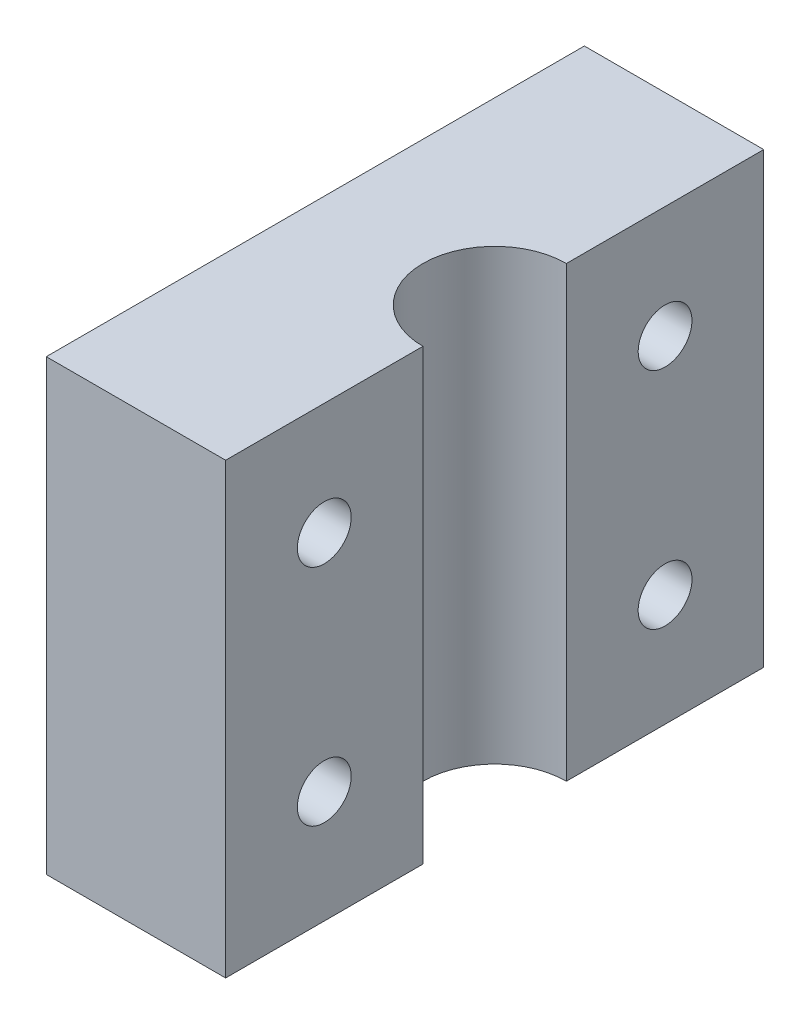
ISO-10303-21;
HEADER;
FILE_DESCRIPTION(('STEP AP214'),'2;1');
FILE_NAME('part.step','',(''),(''),'','','');
FILE_SCHEMA(('AUTOMOTIVE_DESIGN { 1 0 10303 214 1 1 1 1 }'));
ENDSEC;
DATA;
#1=APPLICATION_CONTEXT('core data for automotive mechanical design processes');
#2=APPLICATION_PROTOCOL_DEFINITION('international standard','automotive_design',2000,#1);
#3=PRODUCT_CONTEXT('',#1,'mechanical');
#4=PRODUCT('Part','Part','',(#3));
#5=PRODUCT_RELATED_PRODUCT_CATEGORY('part','',(#4));
#6=PRODUCT_DEFINITION_FORMATION('','',#4);
#7=PRODUCT_DEFINITION_CONTEXT('part definition',#1,'design');
#8=PRODUCT_DEFINITION('design','',#6,#7);
#9=PRODUCT_DEFINITION_SHAPE('','',#8);
#10=(LENGTH_UNIT() NAMED_UNIT(*) SI_UNIT(.MILLI.,.METRE.));
#11=(NAMED_UNIT(*) PLANE_ANGLE_UNIT() SI_UNIT($,.RADIAN.));
#12=(NAMED_UNIT(*) SI_UNIT($,.STERADIAN.) SOLID_ANGLE_UNIT());
#13=UNCERTAINTY_MEASURE_WITH_UNIT(LENGTH_MEASURE(1.E-05),#10,'distance_accuracy_value','');
#14=(GEOMETRIC_REPRESENTATION_CONTEXT(3) GLOBAL_UNCERTAINTY_ASSIGNED_CONTEXT((#13)) GLOBAL_UNIT_ASSIGNED_CONTEXT((#10,
#11,#12)) REPRESENTATION_CONTEXT('',''));
#15=CARTESIAN_POINT('',(0.,0.,0.));
#16=DIRECTION('',(0.,0.,1.));
#17=DIRECTION('',(1.,0.,0.));
#18=AXIS2_PLACEMENT_3D('',#15,#16,#17);
#19=CARTESIAN_POINT('',(10.,0.,0.));
#20=DIRECTION('',(-1.,0.,0.));
#21=DIRECTION('',(0.,0.,1.));
#22=AXIS2_PLACEMENT_3D('',#19,#20,#21);
#23=PLANE('',#22);
#24=CARTESIAN_POINT('',(10.,6.25,-5.5));
#25=DIRECTION('',(-1.,0.,0.));
#26=DIRECTION('',(0.,0.,1.));
#27=AXIS2_PLACEMENT_3D('',#24,#25,#26);
#28=CIRCLE('',#27,1.5);
#29=CARTESIAN_POINT('',(10.,6.25,-4.));
#30=VERTEX_POINT('',#29);
#31=EDGE_CURVE('E138',#30,#30,#28,.T.);
#32=ORIENTED_EDGE('',*,*,#31,.T.);
#33=EDGE_LOOP('',(#32));
#34=FACE_BOUND('',#33,.T.);
#35=CARTESIAN_POINT('',(10.,18.75,-5.5));
#36=DIRECTION('',(1.,0.,0.));
#37=DIRECTION('',(0.,0.,-1.));
#38=AXIS2_PLACEMENT_3D('',#35,#36,#37);
#39=CIRCLE('',#38,1.5);
#40=CARTESIAN_POINT('',(10.,18.75,-7.));
#41=VERTEX_POINT('',#40);
#42=EDGE_CURVE('E135',#41,#41,#39,.T.);
#43=ORIENTED_EDGE('',*,*,#42,.F.);
#44=EDGE_LOOP('',(#43));
#45=FACE_BOUND('',#44,.T.);
#46=DIRECTION('',(0.,0.,-1.));
#47=VECTOR('',#46,1.);
#48=CARTESIAN_POINT('',(10.,0.,0.));
#49=LINE('',#48,#47);
#50=CARTESIAN_POINT('',(10.,0.,0.));
#51=VERTEX_POINT('',#50);
#52=CARTESIAN_POINT('',(10.,0.,-11.));
#53=VERTEX_POINT('',#52);
#54=EDGE_CURVE('E85',#51,#53,#49,.T.);
#55=ORIENTED_EDGE('',*,*,#54,.T.);
#56=DIRECTION('',(0.,1.,0.));
#57=VECTOR('',#56,1.);
#58=CARTESIAN_POINT('',(10.,0.,-11.));
#59=LINE('',#58,#57);
#60=CARTESIAN_POINT('',(10.,25.,-11.));
#61=VERTEX_POINT('',#60);
#62=EDGE_CURVE('E11',#53,#61,#59,.T.);
#63=ORIENTED_EDGE('',*,*,#62,.T.);
#64=DIRECTION('',(0.,0.,1.));
#65=VECTOR('',#64,1.);
#66=CARTESIAN_POINT('',(10.,25.,0.));
#67=LINE('',#66,#65);
#68=CARTESIAN_POINT('',(10.,25.,0.));
#69=VERTEX_POINT('',#68);
#70=EDGE_CURVE('E56',#61,#69,#67,.T.);
#71=ORIENTED_EDGE('',*,*,#70,.T.);
#72=DIRECTION('',(0.,-1.,0.));
#73=VECTOR('',#72,1.);
#74=CARTESIAN_POINT('',(10.,0.,0.));
#75=LINE('',#74,#73);
#76=EDGE_CURVE('E117',#69,#51,#75,.T.);
#77=ORIENTED_EDGE('',*,*,#76,.T.);
#78=EDGE_LOOP('',(#55,#63,#71,#77));
#79=FACE_BOUND('',#78,.T.);
#80=ADVANCED_FACE('F33',(#34,#45,#79),#23,.F.);
#81=CARTESIAN_POINT('',(10.,0.,0.));
#82=DIRECTION('',(0.,0.,-1.));
#83=DIRECTION('',(-1.,0.,0.));
#84=AXIS2_PLACEMENT_3D('',#81,#82,#83);
#85=PLANE('',#84);
#86=DIRECTION('',(0.,-1.,0.));
#87=VECTOR('',#86,1.);
#88=CARTESIAN_POINT('',(0.,0.,0.));
#89=LINE('',#88,#87);
#90=CARTESIAN_POINT('',(0.,25.,0.));
#91=VERTEX_POINT('',#90);
#92=CARTESIAN_POINT('',(0.,0.,0.));
#93=VERTEX_POINT('',#92);
#94=EDGE_CURVE('E109',#91,#93,#89,.T.);
#95=ORIENTED_EDGE('',*,*,#94,.T.);
#96=DIRECTION('',(-1.,0.,0.));
#97=VECTOR('',#96,1.);
#98=CARTESIAN_POINT('',(10.,0.,0.));
#99=LINE('',#98,#97);
#100=EDGE_CURVE('E124',#51,#93,#99,.T.);
#101=ORIENTED_EDGE('',*,*,#100,.F.);
#102=ORIENTED_EDGE('',*,*,#76,.F.);
#103=DIRECTION('',(-1.,0.,0.));
#104=VECTOR('',#103,1.);
#105=CARTESIAN_POINT('',(10.,25.,0.));
#106=LINE('',#105,#104);
#107=EDGE_CURVE('E101',#69,#91,#106,.T.);
#108=ORIENTED_EDGE('',*,*,#107,.T.);
#109=EDGE_LOOP('',(#95,#101,#102,#108));
#110=FACE_BOUND('',#109,.T.);
#111=ADVANCED_FACE('F35',(#110),#85,.F.);
#112=CARTESIAN_POINT('',(10.,0.,0.));
#113=DIRECTION('',(0.,1.,0.));
#114=DIRECTION('',(0.,0.,1.));
#115=AXIS2_PLACEMENT_3D('',#112,#113,#114);
#116=PLANE('',#115);
#117=CARTESIAN_POINT('',(10.,0.,-19.));
#118=VERTEX_POINT('',#117);
#119=CARTESIAN_POINT('',(10.,0.,-30.));
#120=VERTEX_POINT('',#119);
#121=EDGE_CURVE('E128',#118,#120,#49,.T.);
#122=ORIENTED_EDGE('',*,*,#121,.F.);
#123=CARTESIAN_POINT('',(10.,0.,-15.));
#124=DIRECTION('',(0.,1.,0.));
#125=DIRECTION('',(0.,0.,1.));
#126=AXIS2_PLACEMENT_3D('',#123,#124,#125);
#127=CIRCLE('',#126,4.);
#128=EDGE_CURVE('E48',#118,#53,#127,.T.);
#129=ORIENTED_EDGE('',*,*,#128,.T.);
#130=ORIENTED_EDGE('',*,*,#54,.F.);
#131=ORIENTED_EDGE('',*,*,#100,.T.);
#132=DIRECTION('',(0.,0.,-1.));
#133=VECTOR('',#132,1.);
#134=CARTESIAN_POINT('',(0.,0.,0.));
#135=LINE('',#134,#133);
#136=CARTESIAN_POINT('',(0.,0.,-30.));
#137=VERTEX_POINT('',#136);
#138=EDGE_CURVE('E112',#93,#137,#135,.T.);
#139=ORIENTED_EDGE('',*,*,#138,.T.);
#140=DIRECTION('',(-1.,0.,0.));
#141=VECTOR('',#140,1.);
#142=CARTESIAN_POINT('',(10.,0.,-30.));
#143=LINE('',#142,#141);
#144=EDGE_CURVE('E121',#120,#137,#143,.T.);
#145=ORIENTED_EDGE('',*,*,#144,.F.);
#146=EDGE_LOOP('',(#122,#129,#130,#131,#139,#145));
#147=FACE_BOUND('',#146,.T.);
#148=ADVANCED_FACE('F130',(#147),#116,.F.);
#149=CARTESIAN_POINT('',(10.,0.,-30.));
#150=DIRECTION('',(0.,0.,1.));
#151=DIRECTION('',(1.,0.,0.));
#152=AXIS2_PLACEMENT_3D('',#149,#150,#151);
#153=PLANE('',#152);
#154=DIRECTION('',(0.,1.,0.));
#155=VECTOR('',#154,1.);
#156=CARTESIAN_POINT('',(0.,0.,-30.));
#157=LINE('',#156,#155);
#158=CARTESIAN_POINT('',(0.,25.,-30.));
#159=VERTEX_POINT('',#158);
#160=EDGE_CURVE('E114',#137,#159,#157,.T.);
#161=ORIENTED_EDGE('',*,*,#160,.T.);
#162=DIRECTION('',(-1.,0.,0.));
#163=VECTOR('',#162,1.);
#164=CARTESIAN_POINT('',(10.,25.,-30.));
#165=LINE('',#164,#163);
#166=CARTESIAN_POINT('',(10.,25.,-30.));
#167=VERTEX_POINT('',#166);
#168=EDGE_CURVE('E119',#167,#159,#165,.T.);
#169=ORIENTED_EDGE('',*,*,#168,.F.);
#170=DIRECTION('',(0.,1.,0.));
#171=VECTOR('',#170,1.);
#172=CARTESIAN_POINT('',(10.,0.,-30.));
#173=LINE('',#172,#171);
#174=EDGE_CURVE('E104',#120,#167,#173,.T.);
#175=ORIENTED_EDGE('',*,*,#174,.F.);
#176=ORIENTED_EDGE('',*,*,#144,.T.);
#177=EDGE_LOOP('',(#161,#169,#175,#176));
#178=FACE_BOUND('',#177,.T.);
#179=ADVANCED_FACE('F189',(#178),#153,.F.);
#180=CARTESIAN_POINT('',(10.,25.,0.));
#181=DIRECTION('',(0.,-1.,0.));
#182=DIRECTION('',(0.,0.,-1.));
#183=AXIS2_PLACEMENT_3D('',#180,#181,#182);
#184=PLANE('',#183);
#185=ORIENTED_EDGE('',*,*,#70,.F.);
#186=CARTESIAN_POINT('',(10.,25.,-15.));
#187=DIRECTION('',(0.,1.,0.));
#188=DIRECTION('',(0.,0.,1.));
#189=AXIS2_PLACEMENT_3D('',#186,#187,#188);
#190=CIRCLE('',#189,4.);
#191=CARTESIAN_POINT('',(10.,25.,-19.));
#192=VERTEX_POINT('',#191);
#193=EDGE_CURVE('E94',#192,#61,#190,.T.);
#194=ORIENTED_EDGE('',*,*,#193,.F.);
#195=EDGE_CURVE('E103',#167,#192,#67,.T.);
#196=ORIENTED_EDGE('',*,*,#195,.F.);
#197=ORIENTED_EDGE('',*,*,#168,.T.);
#198=DIRECTION('',(0.,0.,1.));
#199=VECTOR('',#198,1.);
#200=CARTESIAN_POINT('',(0.,25.,0.));
#201=LINE('',#200,#199);
#202=EDGE_CURVE('E78',#159,#91,#201,.T.);
#203=ORIENTED_EDGE('',*,*,#202,.T.);
#204=ORIENTED_EDGE('',*,*,#107,.F.);
#205=EDGE_LOOP('',(#185,#194,#196,#197,#203,#204));
#206=FACE_BOUND('',#205,.T.);
#207=ADVANCED_FACE('F100',(#206),#184,.F.);
#208=CARTESIAN_POINT('',(10.,18.75,-24.5));
#209=DIRECTION('',(-1.,0.,0.));
#210=DIRECTION('',(0.,0.,1.));
#211=AXIS2_PLACEMENT_3D('',#208,#209,#210);
#212=CIRCLE('',#211,1.5);
#213=CARTESIAN_POINT('',(10.,18.75,-23.));
#214=VERTEX_POINT('',#213);
#215=EDGE_CURVE('E150',#214,#214,#212,.T.);
#216=ORIENTED_EDGE('',*,*,#215,.T.);
#217=EDGE_LOOP('',(#216));
#218=FACE_BOUND('',#217,.T.);
#219=CARTESIAN_POINT('',(10.,6.25,-24.5));
#220=DIRECTION('',(1.,0.,0.));
#221=DIRECTION('',(0.,0.,-1.));
#222=AXIS2_PLACEMENT_3D('',#219,#220,#221);
#223=CIRCLE('',#222,1.5);
#224=CARTESIAN_POINT('',(10.,6.25,-26.));
#225=VERTEX_POINT('',#224);
#226=EDGE_CURVE('E144',#225,#225,#223,.T.);
#227=ORIENTED_EDGE('',*,*,#226,.F.);
#228=EDGE_LOOP('',(#227));
#229=FACE_BOUND('',#228,.T.);
#230=ORIENTED_EDGE('',*,*,#195,.T.);
#231=DIRECTION('',(0.,1.,0.));
#232=VECTOR('',#231,1.);
#233=CARTESIAN_POINT('',(10.,0.,-19.));
#234=LINE('',#233,#232);
#235=EDGE_CURVE('E41',#192,#118,#234,.F.);
#236=ORIENTED_EDGE('',*,*,#235,.T.);
#237=ORIENTED_EDGE('',*,*,#121,.T.);
#238=ORIENTED_EDGE('',*,*,#174,.T.);
#239=EDGE_LOOP('',(#230,#236,#237,#238));
#240=FACE_BOUND('',#239,.T.);
#241=ADVANCED_FACE('F127',(#218,#229,#240),#23,.F.);
#242=CARTESIAN_POINT('',(0.,0.,0.));
#243=DIRECTION('',(-1.,0.,0.));
#244=DIRECTION('',(0.,0.,1.));
#245=AXIS2_PLACEMENT_3D('',#242,#243,#244);
#246=PLANE('',#245);
#247=CARTESIAN_POINT('',(0.,18.75,-24.5));
#248=DIRECTION('',(-1.,0.,0.));
#249=DIRECTION('',(0.,0.,1.));
#250=AXIS2_PLACEMENT_3D('',#247,#248,#249);
#251=CIRCLE('',#250,1.5);
#252=CARTESIAN_POINT('',(0.,18.75,-23.));
#253=VERTEX_POINT('',#252);
#254=EDGE_CURVE('E153',#253,#253,#251,.T.);
#255=ORIENTED_EDGE('',*,*,#254,.F.);
#256=EDGE_LOOP('',(#255));
#257=FACE_BOUND('',#256,.T.);
#258=CARTESIAN_POINT('',(0.,6.25,-24.5));
#259=DIRECTION('',(1.,0.,0.));
#260=DIRECTION('',(0.,0.,-1.));
#261=AXIS2_PLACEMENT_3D('',#258,#259,#260);
#262=CIRCLE('',#261,1.5);
#263=CARTESIAN_POINT('',(0.,6.25,-26.));
#264=VERTEX_POINT('',#263);
#265=EDGE_CURVE('E147',#264,#264,#262,.T.);
#266=ORIENTED_EDGE('',*,*,#265,.T.);
#267=EDGE_LOOP('',(#266));
#268=FACE_BOUND('',#267,.T.);
#269=CARTESIAN_POINT('',(0.,6.25,-5.5));
#270=DIRECTION('',(-1.,0.,0.));
#271=DIRECTION('',(0.,0.,1.));
#272=AXIS2_PLACEMENT_3D('',#269,#270,#271);
#273=CIRCLE('',#272,1.5);
#274=CARTESIAN_POINT('',(0.,6.25,-4.));
#275=VERTEX_POINT('',#274);
#276=EDGE_CURVE('E141',#275,#275,#273,.T.);
#277=ORIENTED_EDGE('',*,*,#276,.F.);
#278=EDGE_LOOP('',(#277));
#279=FACE_BOUND('',#278,.T.);
#280=CARTESIAN_POINT('',(0.,18.75,-5.5));
#281=DIRECTION('',(1.,0.,0.));
#282=DIRECTION('',(0.,0.,-1.));
#283=AXIS2_PLACEMENT_3D('',#280,#281,#282);
#284=CIRCLE('',#283,1.5);
#285=CARTESIAN_POINT('',(0.,18.75,-7.));
#286=VERTEX_POINT('',#285);
#287=EDGE_CURVE('E98',#286,#286,#284,.T.);
#288=ORIENTED_EDGE('',*,*,#287,.T.);
#289=EDGE_LOOP('',(#288));
#290=FACE_BOUND('',#289,.T.);
#291=ORIENTED_EDGE('',*,*,#94,.F.);
#292=ORIENTED_EDGE('',*,*,#202,.F.);
#293=ORIENTED_EDGE('',*,*,#160,.F.);
#294=ORIENTED_EDGE('',*,*,#138,.F.);
#295=EDGE_LOOP('',(#291,#292,#293,#294));
#296=FACE_BOUND('',#295,.T.);
#297=ADVANCED_FACE('F183',(#257,#268,#279,#290,#296),#246,.T.);
#298=CARTESIAN_POINT('',(10.,0.,-15.));
#299=DIRECTION('',(0.,1.,0.));
#300=DIRECTION('',(0.,0.,1.));
#301=AXIS2_PLACEMENT_3D('',#298,#299,#300);
#302=CYLINDRICAL_SURFACE('',#301,4.);
#303=ORIENTED_EDGE('',*,*,#128,.F.);
#304=ORIENTED_EDGE('',*,*,#235,.F.);
#305=ORIENTED_EDGE('',*,*,#193,.T.);
#306=ORIENTED_EDGE('',*,*,#62,.F.);
#307=EDGE_LOOP('',(#303,#304,#305,#306));
#308=FACE_BOUND('',#307,.T.);
#309=ADVANCED_FACE('F95',(#308),#302,.F.);
#310=CARTESIAN_POINT('',(0.,18.75,-5.5));
#311=DIRECTION('',(1.,0.,0.));
#312=DIRECTION('',(0.,0.,-1.));
#313=AXIS2_PLACEMENT_3D('',#310,#311,#312);
#314=CYLINDRICAL_SURFACE('',#313,1.5);
#315=ORIENTED_EDGE('',*,*,#287,.F.);
#316=EDGE_LOOP('',(#315));
#317=FACE_BOUND('',#316,.T.);
#318=ORIENTED_EDGE('',*,*,#42,.T.);
#319=EDGE_LOOP('',(#318));
#320=FACE_BOUND('',#319,.T.);
#321=ADVANCED_FACE('F239',(#317,#320),#314,.F.);
#322=CARTESIAN_POINT('',(0.,6.25,-5.5));
#323=DIRECTION('',(1.,0.,0.));
#324=DIRECTION('',(0.,0.,-1.));
#325=AXIS2_PLACEMENT_3D('',#322,#323,#324);
#326=CYLINDRICAL_SURFACE('',#325,1.5);
#327=ORIENTED_EDGE('',*,*,#276,.T.);
#328=EDGE_LOOP('',(#327));
#329=FACE_BOUND('',#328,.T.);
#330=ORIENTED_EDGE('',*,*,#31,.F.);
#331=EDGE_LOOP('',(#330));
#332=FACE_BOUND('',#331,.T.);
#333=ADVANCED_FACE('F169',(#329,#332),#326,.F.);
#334=CARTESIAN_POINT('',(0.,6.25,-24.5));
#335=DIRECTION('',(1.,0.,0.));
#336=DIRECTION('',(0.,0.,-1.));
#337=AXIS2_PLACEMENT_3D('',#334,#335,#336);
#338=CYLINDRICAL_SURFACE('',#337,1.5);
#339=ORIENTED_EDGE('',*,*,#265,.F.);
#340=EDGE_LOOP('',(#339));
#341=FACE_BOUND('',#340,.T.);
#342=ORIENTED_EDGE('',*,*,#226,.T.);
#343=EDGE_LOOP('',(#342));
#344=FACE_BOUND('',#343,.T.);
#345=ADVANCED_FACE('F163',(#341,#344),#338,.F.);
#346=CARTESIAN_POINT('',(0.,18.75,-24.5));
#347=DIRECTION('',(1.,0.,0.));
#348=DIRECTION('',(0.,0.,-1.));
#349=AXIS2_PLACEMENT_3D('',#346,#347,#348);
#350=CYLINDRICAL_SURFACE('',#349,1.5);
#351=ORIENTED_EDGE('',*,*,#254,.T.);
#352=EDGE_LOOP('',(#351));
#353=FACE_BOUND('',#352,.T.);
#354=ORIENTED_EDGE('',*,*,#215,.F.);
#355=EDGE_LOOP('',(#354));
#356=FACE_BOUND('',#355,.T.);
#357=ADVANCED_FACE('F161',(#353,#356),#350,.F.);
#358=CLOSED_SHELL('',(#80,#111,#148,#179,#207,#241,#297,#309,#321,#333,#345,#357));
#359=MANIFOLD_SOLID_BREP('B2',#358);
#360=ADVANCED_BREP_SHAPE_REPRESENTATION('',(#18,#359),#14);
#361=SHAPE_DEFINITION_REPRESENTATION(#9,#360);
ENDSEC;
END-ISO-10303-21;
